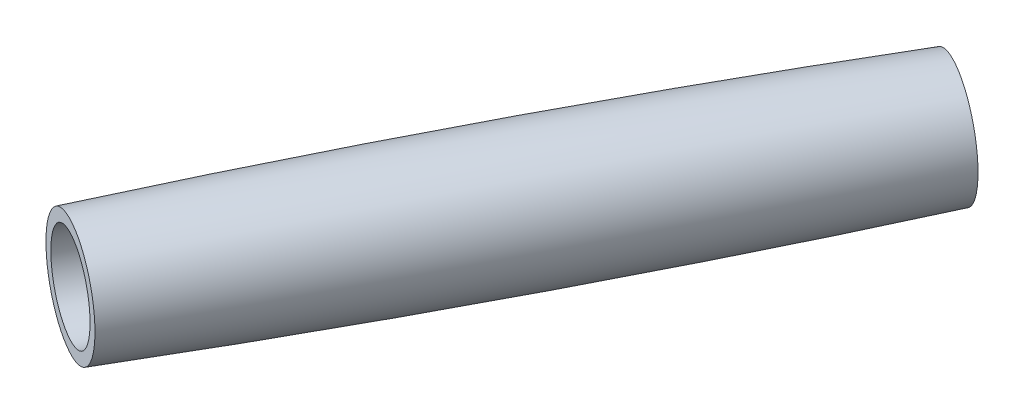
ISO-10303-21;
HEADER;
FILE_DESCRIPTION(('STEP AP214'),'2;1');
FILE_NAME('part.step','',(''),(''),'','','');
FILE_SCHEMA(('AUTOMOTIVE_DESIGN { 1 0 10303 214 1 1 1 1 }'));
ENDSEC;
DATA;
#1=APPLICATION_CONTEXT('core data for automotive mechanical design processes');
#2=APPLICATION_PROTOCOL_DEFINITION('international standard','automotive_design',2000,#1);
#3=PRODUCT_CONTEXT('',#1,'mechanical');
#4=PRODUCT('Part','Part','',(#3));
#5=PRODUCT_RELATED_PRODUCT_CATEGORY('part','',(#4));
#6=PRODUCT_DEFINITION_FORMATION('','',#4);
#7=PRODUCT_DEFINITION_CONTEXT('part definition',#1,'design');
#8=PRODUCT_DEFINITION('design','',#6,#7);
#9=PRODUCT_DEFINITION_SHAPE('','',#8);
#10=(LENGTH_UNIT() NAMED_UNIT(*) SI_UNIT(.MILLI.,.METRE.));
#11=(NAMED_UNIT(*) PLANE_ANGLE_UNIT() SI_UNIT($,.RADIAN.));
#12=(NAMED_UNIT(*) SI_UNIT($,.STERADIAN.) SOLID_ANGLE_UNIT());
#13=UNCERTAINTY_MEASURE_WITH_UNIT(LENGTH_MEASURE(1.E-05),#10,'distance_accuracy_value','');
#14=(GEOMETRIC_REPRESENTATION_CONTEXT(3) GLOBAL_UNCERTAINTY_ASSIGNED_CONTEXT((#13)) GLOBAL_UNIT_ASSIGNED_CONTEXT((#10,
#11,#12)) REPRESENTATION_CONTEXT('',''));
#15=CARTESIAN_POINT('',(0.,0.,0.));
#16=DIRECTION('',(0.,0.,1.));
#17=DIRECTION('',(1.,0.,0.));
#18=AXIS2_PLACEMENT_3D('',#15,#16,#17);
#19=CARTESIAN_POINT('',(0.,194.571784647721,0.));
#20=DIRECTION('',(-0.463600563550686,0.,0.886044308979797));
#21=DIRECTION('',(0.886044308979797,0.,0.463600563550686));
#22=AXIS2_PLACEMENT_3D('',#19,#20,#21);
#23=DEGENERATE_TOROIDAL_SURFACE('',#22,924.344779325799,929.772994678078,.F.);
#24=CARTESIAN_POINT('',(-13.080625846028,194.571784647721,25.));
#25=DIRECTION('',(-0.463600563550686,0.,0.886044308979797));
#26=DIRECTION('',(0.886044308979797,0.,0.463600563550686));
#27=AXIS2_PLACEMENT_3D('',#24,#25,#26);
#28=CIRCLE('',#27,5.);
#29=CARTESIAN_POINT('',(-8.65040430112901,194.571784647721,27.3180028177534));
#30=VERTEX_POINT('',#29);
#31=EDGE_CURVE('E59',#30,#30,#28,.T.);
#32=ORIENTED_EDGE('',*,*,#31,.F.);
#33=EDGE_LOOP('',(#32));
#34=FACE_BOUND('',#33,.T.);
#35=CARTESIAN_POINT('',(13.080625846028,194.571784647721,-25.));
#36=DIRECTION('',(-0.463600563550686,0.,0.886044308979797));
#37=DIRECTION('',(0.886044308979797,0.,0.463600563550686));
#38=AXIS2_PLACEMENT_3D('',#35,#36,#37);
#39=CIRCLE('',#38,5.);
#40=CARTESIAN_POINT('',(17.510847390927,194.571784647721,-22.6819971822466));
#41=VERTEX_POINT('',#40);
#42=EDGE_CURVE('E10',#41,#41,#39,.T.);
#43=ORIENTED_EDGE('',*,*,#42,.T.);
#44=EDGE_LOOP('',(#43));
#45=FACE_BOUND('',#44,.T.);
#46=ADVANCED_FACE('F31',(#34,#45),#23,.F.);
#47=CARTESIAN_POINT('',(13.080625846028,198.571784647721,-25.));
#48=DIRECTION('',(-0.463600563550686,0.,0.886044308979797));
#49=DIRECTION('',(0.886044308979797,0.,0.463600563550686));
#50=AXIS2_PLACEMENT_3D('',#47,#48,#49);
#51=PLANE('',#50);
#52=ORIENTED_EDGE('',*,*,#42,.F.);
#53=EDGE_LOOP('',(#52));
#54=FACE_BOUND('',#53,.T.);
#55=CARTESIAN_POINT('',(13.080625846028,194.571784647721,-25.));
#56=DIRECTION('',(-0.463600563550686,0.,0.886044308979797));
#57=DIRECTION('',(0.886044308979797,0.,0.463600563550686));
#58=AXIS2_PLACEMENT_3D('',#55,#56,#57);
#59=CIRCLE('',#58,4.);
#60=CARTESIAN_POINT('',(16.6248030819472,194.571784647721,-23.1455977457973));
#61=VERTEX_POINT('',#60);
#62=EDGE_CURVE('E37',#61,#61,#59,.T.);
#63=ORIENTED_EDGE('',*,*,#62,.T.);
#64=EDGE_LOOP('',(#63));
#65=FACE_BOUND('',#64,.T.);
#66=ADVANCED_FACE('F66',(#54,#65),#51,.F.);
#67=CARTESIAN_POINT('',(-13.080625846028,194.571784647721,25.));
#68=DIRECTION('',(-0.463600563550686,0.,0.886044308979797));
#69=DIRECTION('',(0.886044308979797,0.,0.463600563550686));
#70=AXIS2_PLACEMENT_3D('',#67,#68,#69);
#71=CYLINDRICAL_SURFACE('',#70,4.);
#72=ORIENTED_EDGE('',*,*,#62,.F.);
#73=EDGE_LOOP('',(#72));
#74=FACE_BOUND('',#73,.T.);
#75=CARTESIAN_POINT('',(11.2262235918253,194.571784647721,-21.4558227640808));
#76=DIRECTION('',(-0.463600563550686,0.,0.886044308979797));
#77=DIRECTION('',(0.886044308979797,0.,0.463600563550686));
#78=AXIS2_PLACEMENT_3D('',#75,#76,#77);
#79=CIRCLE('',#78,4.);
#80=CARTESIAN_POINT('',(14.7704008277445,194.571784647721,-19.6014205098781));
#81=VERTEX_POINT('',#80);
#82=EDGE_CURVE('E41',#81,#81,#79,.T.);
#83=ORIENTED_EDGE('',*,*,#82,.T.);
#84=EDGE_LOOP('',(#83));
#85=FACE_BOUND('',#84,.T.);
#86=ADVANCED_FACE('F70',(#74,#85),#71,.F.);
#87=CARTESIAN_POINT('',(11.2262235918253,197.571784647721,-21.4558227640808));
#88=DIRECTION('',(-0.463600563550686,0.,0.886044308979797));
#89=DIRECTION('',(0.886044308979797,0.,0.463600563550686));
#90=AXIS2_PLACEMENT_3D('',#87,#88,#89);
#91=PLANE('',#90);
#92=ORIENTED_EDGE('',*,*,#82,.F.);
#93=EDGE_LOOP('',(#92));
#94=FACE_BOUND('',#93,.T.);
#95=CARTESIAN_POINT('',(11.2262235918253,194.571784647721,-21.4558227640808));
#96=DIRECTION('',(-0.463600563550686,0.,0.886044308979797));
#97=DIRECTION('',(0.886044308979797,0.,0.463600563550686));
#98=AXIS2_PLACEMENT_3D('',#95,#96,#97);
#99=CIRCLE('',#98,3.);
#100=CARTESIAN_POINT('',(13.8843565187647,194.571784647721,-20.0650210734288));
#101=VERTEX_POINT('',#100);
#102=EDGE_CURVE('E45',#101,#101,#99,.T.);
#103=ORIENTED_EDGE('',*,*,#102,.T.);
#104=EDGE_LOOP('',(#103));
#105=FACE_BOUND('',#104,.T.);
#106=ADVANCED_FACE('F75',(#94,#105),#91,.F.);
#107=CARTESIAN_POINT('',(-13.080625846028,194.571784647721,25.));
#108=DIRECTION('',(-0.463600563550686,0.,0.886044308979797));
#109=DIRECTION('',(0.886044308979797,0.,0.463600563550686));
#110=AXIS2_PLACEMENT_3D('',#107,#108,#109);
#111=CYLINDRICAL_SURFACE('',#110,3.);
#112=ORIENTED_EDGE('',*,*,#102,.F.);
#113=EDGE_LOOP('',(#112));
#114=FACE_BOUND('',#113,.T.);
#115=CARTESIAN_POINT('',(-11.2262235918253,194.571784647721,21.4558227640808));
#116=DIRECTION('',(-0.463600563550686,0.,0.886044308979797));
#117=DIRECTION('',(0.886044308979797,0.,0.463600563550686));
#118=AXIS2_PLACEMENT_3D('',#115,#116,#117);
#119=CIRCLE('',#118,3.);
#120=CARTESIAN_POINT('',(-8.56809066488586,194.571784647721,22.8466244547329));
#121=VERTEX_POINT('',#120);
#122=EDGE_CURVE('E50',#121,#121,#119,.T.);
#123=ORIENTED_EDGE('',*,*,#122,.T.);
#124=EDGE_LOOP('',(#123));
#125=FACE_BOUND('',#124,.T.);
#126=ADVANCED_FACE('F81',(#114,#125),#111,.F.);
#127=CARTESIAN_POINT('',(-11.2262235918253,198.571784647721,21.4558227640808));
#128=DIRECTION('',(0.463600563550686,0.,-0.886044308979797));
#129=DIRECTION('',(-0.886044308979797,0.,-0.463600563550686));
#130=AXIS2_PLACEMENT_3D('',#127,#128,#129);
#131=PLANE('',#130);
#132=ORIENTED_EDGE('',*,*,#122,.F.);
#133=EDGE_LOOP('',(#132));
#134=FACE_BOUND('',#133,.T.);
#135=CARTESIAN_POINT('',(-11.2262235918253,194.571784647721,21.4558227640808));
#136=DIRECTION('',(-0.463600563550686,0.,0.886044308979797));
#137=DIRECTION('',(0.886044308979797,0.,0.463600563550686));
#138=AXIS2_PLACEMENT_3D('',#135,#136,#137);
#139=CIRCLE('',#138,4.);
#140=CARTESIAN_POINT('',(-7.68204635590606,194.571784647721,23.3102250182836));
#141=VERTEX_POINT('',#140);
#142=EDGE_CURVE('E53',#141,#141,#139,.T.);
#143=ORIENTED_EDGE('',*,*,#142,.T.);
#144=EDGE_LOOP('',(#143));
#145=FACE_BOUND('',#144,.T.);
#146=ADVANCED_FACE('F85',(#134,#145),#131,.F.);
#147=CARTESIAN_POINT('',(-13.080625846028,194.571784647721,25.));
#148=DIRECTION('',(-0.463600563550686,0.,0.886044308979797));
#149=DIRECTION('',(0.886044308979797,0.,0.463600563550686));
#150=AXIS2_PLACEMENT_3D('',#147,#148,#149);
#151=CYLINDRICAL_SURFACE('',#150,4.);
#152=ORIENTED_EDGE('',*,*,#142,.F.);
#153=EDGE_LOOP('',(#152));
#154=FACE_BOUND('',#153,.T.);
#155=CARTESIAN_POINT('',(-13.080625846028,194.571784647721,25.));
#156=DIRECTION('',(-0.463600563550686,0.,0.886044308979797));
#157=DIRECTION('',(0.886044308979797,0.,0.463600563550686));
#158=AXIS2_PLACEMENT_3D('',#155,#156,#157);
#159=CIRCLE('',#158,4.);
#160=CARTESIAN_POINT('',(-9.5364486101088,194.571784647721,26.8544022542027));
#161=VERTEX_POINT('',#160);
#162=EDGE_CURVE('E56',#161,#161,#159,.T.);
#163=ORIENTED_EDGE('',*,*,#162,.T.);
#164=EDGE_LOOP('',(#163));
#165=FACE_BOUND('',#164,.T.);
#166=ADVANCED_FACE('F89',(#154,#165),#151,.F.);
#167=CARTESIAN_POINT('',(-13.080625846028,199.571784647721,25.));
#168=DIRECTION('',(0.463600563550686,0.,-0.886044308979797));
#169=DIRECTION('',(-0.886044308979797,0.,-0.463600563550686));
#170=AXIS2_PLACEMENT_3D('',#167,#168,#169);
#171=PLANE('',#170);
#172=ORIENTED_EDGE('',*,*,#162,.F.);
#173=EDGE_LOOP('',(#172));
#174=FACE_BOUND('',#173,.T.);
#175=ORIENTED_EDGE('',*,*,#31,.T.);
#176=EDGE_LOOP('',(#175));
#177=FACE_BOUND('',#176,.T.);
#178=ADVANCED_FACE('F63',(#174,#177),#171,.F.);
#179=CLOSED_SHELL('',(#46,#66,#86,#106,#126,#146,#166,#178));
#180=MANIFOLD_SOLID_BREP('B2',#179);
#181=ADVANCED_BREP_SHAPE_REPRESENTATION('',(#18,#180),#14);
#182=SHAPE_DEFINITION_REPRESENTATION(#9,#181);
ENDSEC;
END-ISO-10303-21;
